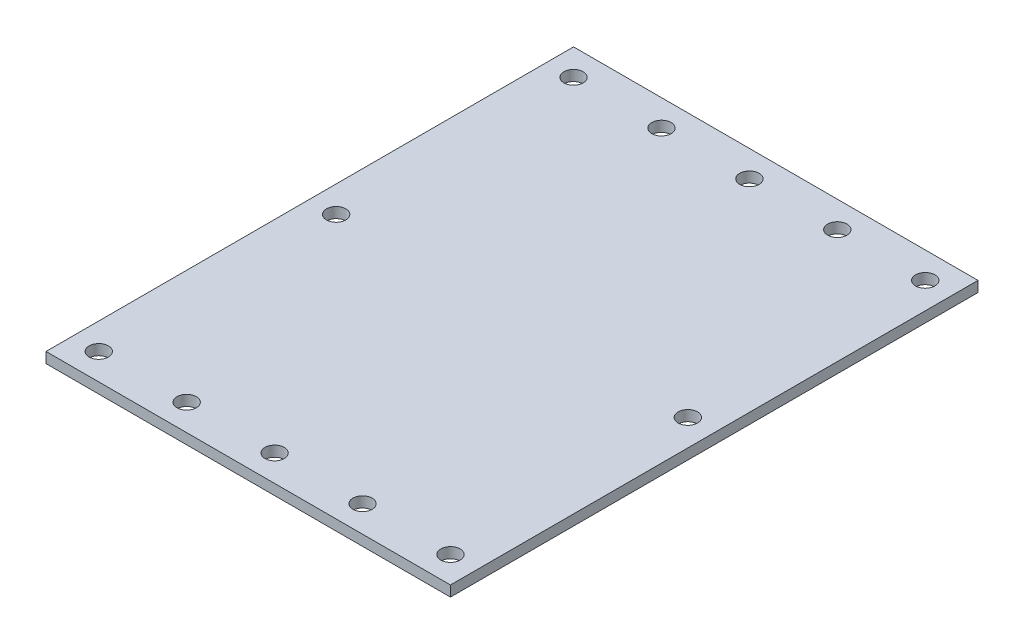
ISO-10303-21;
HEADER;
FILE_DESCRIPTION(('STEP AP214'),'2;1');
FILE_NAME('part.step','',(''),(''),'','','');
FILE_SCHEMA(('AUTOMOTIVE_DESIGN { 1 0 10303 214 1 1 1 1 }'));
ENDSEC;
DATA;
#1=APPLICATION_CONTEXT('core data for automotive mechanical design processes');
#2=APPLICATION_PROTOCOL_DEFINITION('international standard','automotive_design',2000,#1);
#3=PRODUCT_CONTEXT('',#1,'mechanical');
#4=PRODUCT('Part','Part','',(#3));
#5=PRODUCT_RELATED_PRODUCT_CATEGORY('part','',(#4));
#6=PRODUCT_DEFINITION_FORMATION('','',#4);
#7=PRODUCT_DEFINITION_CONTEXT('part definition',#1,'design');
#8=PRODUCT_DEFINITION('design','',#6,#7);
#9=PRODUCT_DEFINITION_SHAPE('','',#8);
#10=(LENGTH_UNIT() NAMED_UNIT(*) SI_UNIT(.MILLI.,.METRE.));
#11=(NAMED_UNIT(*) PLANE_ANGLE_UNIT() SI_UNIT($,.RADIAN.));
#12=(NAMED_UNIT(*) SI_UNIT($,.STERADIAN.) SOLID_ANGLE_UNIT());
#13=UNCERTAINTY_MEASURE_WITH_UNIT(LENGTH_MEASURE(1.E-05),#10,'distance_accuracy_value','');
#14=(GEOMETRIC_REPRESENTATION_CONTEXT(3) GLOBAL_UNCERTAINTY_ASSIGNED_CONTEXT((#13)) GLOBAL_UNIT_ASSIGNED_CONTEXT((#10,
#11,#12)) REPRESENTATION_CONTEXT('',''));
#15=CARTESIAN_POINT('',(0.,0.,0.));
#16=DIRECTION('',(0.,0.,1.));
#17=DIRECTION('',(1.,0.,0.));
#18=AXIS2_PLACEMENT_3D('',#15,#16,#17);
#19=CARTESIAN_POINT('',(0.,6.,0.));
#20=DIRECTION('',(0.,-1.,0.));
#21=DIRECTION('',(0.,0.,-1.));
#22=AXIS2_PLACEMENT_3D('',#19,#20,#21);
#23=PLANE('',#22);
#24=DIRECTION('',(0.,0.,1.));
#25=VECTOR('',#24,1.);
#26=CARTESIAN_POINT('',(0.,6.,0.));
#27=LINE('',#26,#25);
#28=CARTESIAN_POINT('',(0.,6.,-300.));
#29=VERTEX_POINT('',#28);
#30=CARTESIAN_POINT('',(0.,6.,0.));
#31=VERTEX_POINT('',#30);
#32=EDGE_CURVE('E90',#29,#31,#27,.T.);
#33=ORIENTED_EDGE('',*,*,#32,.T.);
#34=DIRECTION('',(1.,0.,0.));
#35=VECTOR('',#34,1.);
#36=CARTESIAN_POINT('',(0.,6.,0.));
#37=LINE('',#36,#35);
#38=CARTESIAN_POINT('',(230.,6.,0.));
#39=VERTEX_POINT('',#38);
#40=EDGE_CURVE('E85',#31,#39,#37,.T.);
#41=ORIENTED_EDGE('',*,*,#40,.T.);
#42=DIRECTION('',(0.,0.,-1.));
#43=VECTOR('',#42,1.);
#44=CARTESIAN_POINT('',(230.,6.,0.));
#45=LINE('',#44,#43);
#46=CARTESIAN_POINT('',(230.,6.,-300.));
#47=VERTEX_POINT('',#46);
#48=EDGE_CURVE('E88',#39,#47,#45,.T.);
#49=ORIENTED_EDGE('',*,*,#48,.T.);
#50=DIRECTION('',(-1.,0.,0.));
#51=VECTOR('',#50,1.);
#52=CARTESIAN_POINT('',(0.,6.,-300.));
#53=LINE('',#52,#51);
#54=EDGE_CURVE('E55',#47,#29,#53,.T.);
#55=ORIENTED_EDGE('',*,*,#54,.T.);
#56=EDGE_LOOP('',(#33,#41,#49,#55));
#57=FACE_BOUND('',#56,.T.);
#58=CARTESIAN_POINT('',(15.,6.,-15.));
#59=DIRECTION('',(0.,1.,0.));
#60=DIRECTION('',(0.,0.,1.));
#61=AXIS2_PLACEMENT_3D('',#58,#59,#60);
#62=CIRCLE('',#61,5.5);
#63=CARTESIAN_POINT('',(15.,6.,-9.5));
#64=VERTEX_POINT('',#63);
#65=EDGE_CURVE('E105',#64,#64,#62,.T.);
#66=ORIENTED_EDGE('',*,*,#65,.F.);
#67=EDGE_LOOP('',(#66));
#68=FACE_BOUND('',#67,.T.);
#69=CARTESIAN_POINT('',(15.,6.,-285.));
#70=DIRECTION('',(0.,1.,0.));
#71=DIRECTION('',(0.,0.,1.));
#72=AXIS2_PLACEMENT_3D('',#69,#70,#71);
#73=CIRCLE('',#72,5.5);
#74=CARTESIAN_POINT('',(15.,6.,-279.5));
#75=VERTEX_POINT('',#74);
#76=EDGE_CURVE('E120',#75,#75,#73,.T.);
#77=ORIENTED_EDGE('',*,*,#76,.F.);
#78=EDGE_LOOP('',(#77));
#79=FACE_BOUND('',#78,.T.);
#80=CARTESIAN_POINT('',(15.,6.,-150.));
#81=DIRECTION('',(0.,1.,0.));
#82=DIRECTION('',(0.,0.,1.));
#83=AXIS2_PLACEMENT_3D('',#80,#81,#82);
#84=CIRCLE('',#83,5.5);
#85=CARTESIAN_POINT('',(15.,6.,-144.5));
#86=VERTEX_POINT('',#85);
#87=EDGE_CURVE('E126',#86,#86,#84,.T.);
#88=ORIENTED_EDGE('',*,*,#87,.F.);
#89=EDGE_LOOP('',(#88));
#90=FACE_BOUND('',#89,.T.);
#91=CARTESIAN_POINT('',(215.,6.,-15.));
#92=DIRECTION('',(0.,1.,0.));
#93=DIRECTION('',(0.,0.,-1.));
#94=AXIS2_PLACEMENT_3D('',#91,#92,#93);
#95=CIRCLE('',#94,5.50000000000002);
#96=CARTESIAN_POINT('',(215.,6.,-20.5));
#97=VERTEX_POINT('',#96);
#98=EDGE_CURVE('E132',#97,#97,#95,.T.);
#99=ORIENTED_EDGE('',*,*,#98,.F.);
#100=EDGE_LOOP('',(#99));
#101=FACE_BOUND('',#100,.T.);
#102=CARTESIAN_POINT('',(215.,6.,-150.));
#103=DIRECTION('',(0.,1.,0.));
#104=DIRECTION('',(0.,0.,-1.));
#105=AXIS2_PLACEMENT_3D('',#102,#103,#104);
#106=CIRCLE('',#105,5.50000000000002);
#107=CARTESIAN_POINT('',(215.,6.,-155.5));
#108=VERTEX_POINT('',#107);
#109=EDGE_CURVE('E138',#108,#108,#106,.T.);
#110=ORIENTED_EDGE('',*,*,#109,.F.);
#111=EDGE_LOOP('',(#110));
#112=FACE_BOUND('',#111,.T.);
#113=CARTESIAN_POINT('',(215.,6.,-285.));
#114=DIRECTION('',(0.,1.,0.));
#115=DIRECTION('',(0.,0.,-1.));
#116=AXIS2_PLACEMENT_3D('',#113,#114,#115);
#117=CIRCLE('',#116,5.50000000000002);
#118=CARTESIAN_POINT('',(215.,6.,-290.5));
#119=VERTEX_POINT('',#118);
#120=EDGE_CURVE('E144',#119,#119,#117,.T.);
#121=ORIENTED_EDGE('',*,*,#120,.F.);
#122=EDGE_LOOP('',(#121));
#123=FACE_BOUND('',#122,.T.);
#124=CARTESIAN_POINT('',(165.,6.,-15.));
#125=DIRECTION('',(0.,1.,0.));
#126=DIRECTION('',(0.,0.,-1.));
#127=AXIS2_PLACEMENT_3D('',#124,#125,#126);
#128=CIRCLE('',#127,5.50000000000002);
#129=CARTESIAN_POINT('',(165.,6.,-20.5));
#130=VERTEX_POINT('',#129);
#131=EDGE_CURVE('E150',#130,#130,#128,.T.);
#132=ORIENTED_EDGE('',*,*,#131,.F.);
#133=EDGE_LOOP('',(#132));
#134=FACE_BOUND('',#133,.T.);
#135=CARTESIAN_POINT('',(115.,6.,-15.));
#136=DIRECTION('',(0.,1.,0.));
#137=DIRECTION('',(0.,0.,-1.));
#138=AXIS2_PLACEMENT_3D('',#135,#136,#137);
#139=CIRCLE('',#138,5.5);
#140=CARTESIAN_POINT('',(115.,6.,-20.5));
#141=VERTEX_POINT('',#140);
#142=EDGE_CURVE('E156',#141,#141,#139,.T.);
#143=ORIENTED_EDGE('',*,*,#142,.F.);
#144=EDGE_LOOP('',(#143));
#145=FACE_BOUND('',#144,.T.);
#146=CARTESIAN_POINT('',(65.,6.,-15.));
#147=DIRECTION('',(0.,1.,0.));
#148=DIRECTION('',(0.,0.,-1.));
#149=AXIS2_PLACEMENT_3D('',#146,#147,#148);
#150=CIRCLE('',#149,5.5);
#151=CARTESIAN_POINT('',(65.,6.,-20.5));
#152=VERTEX_POINT('',#151);
#153=EDGE_CURVE('E162',#152,#152,#150,.T.);
#154=ORIENTED_EDGE('',*,*,#153,.F.);
#155=EDGE_LOOP('',(#154));
#156=FACE_BOUND('',#155,.T.);
#157=CARTESIAN_POINT('',(165.,6.,-285.));
#158=DIRECTION('',(0.,1.,0.));
#159=DIRECTION('',(0.,0.,-1.));
#160=AXIS2_PLACEMENT_3D('',#157,#158,#159);
#161=CIRCLE('',#160,5.50000000000002);
#162=CARTESIAN_POINT('',(165.,6.,-290.5));
#163=VERTEX_POINT('',#162);
#164=EDGE_CURVE('E168',#163,#163,#161,.T.);
#165=ORIENTED_EDGE('',*,*,#164,.F.);
#166=EDGE_LOOP('',(#165));
#167=FACE_BOUND('',#166,.T.);
#168=CARTESIAN_POINT('',(115.,6.,-285.));
#169=DIRECTION('',(0.,1.,0.));
#170=DIRECTION('',(0.,0.,-1.));
#171=AXIS2_PLACEMENT_3D('',#168,#169,#170);
#172=CIRCLE('',#171,5.5);
#173=CARTESIAN_POINT('',(115.,6.,-290.5));
#174=VERTEX_POINT('',#173);
#175=EDGE_CURVE('E174',#174,#174,#172,.T.);
#176=ORIENTED_EDGE('',*,*,#175,.F.);
#177=EDGE_LOOP('',(#176));
#178=FACE_BOUND('',#177,.T.);
#179=CARTESIAN_POINT('',(65.,6.,-285.));
#180=DIRECTION('',(0.,1.,0.));
#181=DIRECTION('',(0.,0.,-1.));
#182=AXIS2_PLACEMENT_3D('',#179,#180,#181);
#183=CIRCLE('',#182,5.5);
#184=CARTESIAN_POINT('',(65.,6.,-290.5));
#185=VERTEX_POINT('',#184);
#186=EDGE_CURVE('E180',#185,#185,#183,.T.);
#187=ORIENTED_EDGE('',*,*,#186,.F.);
#188=EDGE_LOOP('',(#187));
#189=FACE_BOUND('',#188,.T.);
#190=ADVANCED_FACE('F38',(#57,#68,#79,#90,#101,#112,#123,#134,#145,#156,#167,#178,#189),#23,.F.);
#191=CARTESIAN_POINT('',(0.,0.,0.));
#192=DIRECTION('',(0.,-1.,0.));
#193=DIRECTION('',(0.,0.,-1.));
#194=AXIS2_PLACEMENT_3D('',#191,#192,#193);
#195=PLANE('',#194);
#196=CARTESIAN_POINT('',(115.,0.,-285.));
#197=DIRECTION('',(0.,1.,0.));
#198=DIRECTION('',(0.,0.,-1.));
#199=AXIS2_PLACEMENT_3D('',#196,#197,#198);
#200=CIRCLE('',#199,5.5);
#201=CARTESIAN_POINT('',(115.,0.,-290.5));
#202=VERTEX_POINT('',#201);
#203=EDGE_CURVE('E177',#202,#202,#200,.T.);
#204=ORIENTED_EDGE('',*,*,#203,.T.);
#205=EDGE_LOOP('',(#204));
#206=FACE_BOUND('',#205,.T.);
#207=CARTESIAN_POINT('',(65.,0.,-15.));
#208=DIRECTION('',(0.,1.,0.));
#209=DIRECTION('',(0.,0.,-1.));
#210=AXIS2_PLACEMENT_3D('',#207,#208,#209);
#211=CIRCLE('',#210,5.5);
#212=CARTESIAN_POINT('',(65.,0.,-20.5));
#213=VERTEX_POINT('',#212);
#214=EDGE_CURVE('E165',#213,#213,#211,.T.);
#215=ORIENTED_EDGE('',*,*,#214,.T.);
#216=EDGE_LOOP('',(#215));
#217=FACE_BOUND('',#216,.T.);
#218=CARTESIAN_POINT('',(165.,0.,-15.));
#219=DIRECTION('',(0.,1.,0.));
#220=DIRECTION('',(0.,0.,-1.));
#221=AXIS2_PLACEMENT_3D('',#218,#219,#220);
#222=CIRCLE('',#221,5.50000000000002);
#223=CARTESIAN_POINT('',(165.,0.,-20.5));
#224=VERTEX_POINT('',#223);
#225=EDGE_CURVE('E153',#224,#224,#222,.T.);
#226=ORIENTED_EDGE('',*,*,#225,.T.);
#227=EDGE_LOOP('',(#226));
#228=FACE_BOUND('',#227,.T.);
#229=CARTESIAN_POINT('',(215.,0.,-150.));
#230=DIRECTION('',(0.,1.,0.));
#231=DIRECTION('',(0.,0.,-1.));
#232=AXIS2_PLACEMENT_3D('',#229,#230,#231);
#233=CIRCLE('',#232,5.50000000000002);
#234=CARTESIAN_POINT('',(215.,0.,-155.5));
#235=VERTEX_POINT('',#234);
#236=EDGE_CURVE('E141',#235,#235,#233,.T.);
#237=ORIENTED_EDGE('',*,*,#236,.T.);
#238=EDGE_LOOP('',(#237));
#239=FACE_BOUND('',#238,.T.);
#240=CARTESIAN_POINT('',(15.,0.,-150.));
#241=DIRECTION('',(0.,1.,0.));
#242=DIRECTION('',(0.,0.,1.));
#243=AXIS2_PLACEMENT_3D('',#240,#241,#242);
#244=CIRCLE('',#243,5.5);
#245=CARTESIAN_POINT('',(15.,0.,-144.5));
#246=VERTEX_POINT('',#245);
#247=EDGE_CURVE('E129',#246,#246,#244,.T.);
#248=ORIENTED_EDGE('',*,*,#247,.T.);
#249=EDGE_LOOP('',(#248));
#250=FACE_BOUND('',#249,.T.);
#251=CARTESIAN_POINT('',(15.,0.,-15.));
#252=DIRECTION('',(0.,1.,0.));
#253=DIRECTION('',(0.,0.,1.));
#254=AXIS2_PLACEMENT_3D('',#251,#252,#253);
#255=CIRCLE('',#254,5.5);
#256=CARTESIAN_POINT('',(15.,0.,-9.5));
#257=VERTEX_POINT('',#256);
#258=EDGE_CURVE('E117',#257,#257,#255,.T.);
#259=ORIENTED_EDGE('',*,*,#258,.T.);
#260=EDGE_LOOP('',(#259));
#261=FACE_BOUND('',#260,.T.);
#262=DIRECTION('',(0.,0.,1.));
#263=VECTOR('',#262,1.);
#264=CARTESIAN_POINT('',(0.,0.,0.));
#265=LINE('',#264,#263);
#266=CARTESIAN_POINT('',(0.,0.,-300.));
#267=VERTEX_POINT('',#266);
#268=CARTESIAN_POINT('',(0.,0.,0.));
#269=VERTEX_POINT('',#268);
#270=EDGE_CURVE('E102',#267,#269,#265,.T.);
#271=ORIENTED_EDGE('',*,*,#270,.F.);
#272=DIRECTION('',(-1.,0.,0.));
#273=VECTOR('',#272,1.);
#274=CARTESIAN_POINT('',(0.,0.,-300.));
#275=LINE('',#274,#273);
#276=CARTESIAN_POINT('',(230.,0.,-300.));
#277=VERTEX_POINT('',#276);
#278=EDGE_CURVE('E78',#277,#267,#275,.T.);
#279=ORIENTED_EDGE('',*,*,#278,.F.);
#280=DIRECTION('',(0.,0.,-1.));
#281=VECTOR('',#280,1.);
#282=CARTESIAN_POINT('',(230.,0.,0.));
#283=LINE('',#282,#281);
#284=CARTESIAN_POINT('',(230.,0.,0.));
#285=VERTEX_POINT('',#284);
#286=EDGE_CURVE('E72',#285,#277,#283,.T.);
#287=ORIENTED_EDGE('',*,*,#286,.F.);
#288=DIRECTION('',(1.,0.,0.));
#289=VECTOR('',#288,1.);
#290=CARTESIAN_POINT('',(0.,0.,0.));
#291=LINE('',#290,#289);
#292=EDGE_CURVE('E94',#269,#285,#291,.T.);
#293=ORIENTED_EDGE('',*,*,#292,.F.);
#294=EDGE_LOOP('',(#271,#279,#287,#293));
#295=FACE_BOUND('',#294,.T.);
#296=CARTESIAN_POINT('',(15.,0.,-285.));
#297=DIRECTION('',(0.,1.,0.));
#298=DIRECTION('',(0.,0.,1.));
#299=AXIS2_PLACEMENT_3D('',#296,#297,#298);
#300=CIRCLE('',#299,5.5);
#301=CARTESIAN_POINT('',(15.,0.,-279.5));
#302=VERTEX_POINT('',#301);
#303=EDGE_CURVE('E123',#302,#302,#300,.T.);
#304=ORIENTED_EDGE('',*,*,#303,.T.);
#305=EDGE_LOOP('',(#304));
#306=FACE_BOUND('',#305,.T.);
#307=CARTESIAN_POINT('',(215.,0.,-15.));
#308=DIRECTION('',(0.,1.,0.));
#309=DIRECTION('',(0.,0.,-1.));
#310=AXIS2_PLACEMENT_3D('',#307,#308,#309);
#311=CIRCLE('',#310,5.50000000000002);
#312=CARTESIAN_POINT('',(215.,0.,-20.5));
#313=VERTEX_POINT('',#312);
#314=EDGE_CURVE('E135',#313,#313,#311,.T.);
#315=ORIENTED_EDGE('',*,*,#314,.T.);
#316=EDGE_LOOP('',(#315));
#317=FACE_BOUND('',#316,.T.);
#318=CARTESIAN_POINT('',(215.,0.,-285.));
#319=DIRECTION('',(0.,1.,0.));
#320=DIRECTION('',(0.,0.,-1.));
#321=AXIS2_PLACEMENT_3D('',#318,#319,#320);
#322=CIRCLE('',#321,5.50000000000002);
#323=CARTESIAN_POINT('',(215.,0.,-290.5));
#324=VERTEX_POINT('',#323);
#325=EDGE_CURVE('E147',#324,#324,#322,.T.);
#326=ORIENTED_EDGE('',*,*,#325,.T.);
#327=EDGE_LOOP('',(#326));
#328=FACE_BOUND('',#327,.T.);
#329=CARTESIAN_POINT('',(115.,0.,-15.));
#330=DIRECTION('',(0.,1.,0.));
#331=DIRECTION('',(0.,0.,-1.));
#332=AXIS2_PLACEMENT_3D('',#329,#330,#331);
#333=CIRCLE('',#332,5.5);
#334=CARTESIAN_POINT('',(115.,0.,-20.5));
#335=VERTEX_POINT('',#334);
#336=EDGE_CURVE('E159',#335,#335,#333,.T.);
#337=ORIENTED_EDGE('',*,*,#336,.T.);
#338=EDGE_LOOP('',(#337));
#339=FACE_BOUND('',#338,.T.);
#340=CARTESIAN_POINT('',(165.,0.,-285.));
#341=DIRECTION('',(0.,1.,0.));
#342=DIRECTION('',(0.,0.,-1.));
#343=AXIS2_PLACEMENT_3D('',#340,#341,#342);
#344=CIRCLE('',#343,5.50000000000002);
#345=CARTESIAN_POINT('',(165.,0.,-290.5));
#346=VERTEX_POINT('',#345);
#347=EDGE_CURVE('E171',#346,#346,#344,.T.);
#348=ORIENTED_EDGE('',*,*,#347,.T.);
#349=EDGE_LOOP('',(#348));
#350=FACE_BOUND('',#349,.T.);
#351=CARTESIAN_POINT('',(65.,0.,-285.));
#352=DIRECTION('',(0.,1.,0.));
#353=DIRECTION('',(0.,0.,-1.));
#354=AXIS2_PLACEMENT_3D('',#351,#352,#353);
#355=CIRCLE('',#354,5.5);
#356=CARTESIAN_POINT('',(65.,0.,-290.5));
#357=VERTEX_POINT('',#356);
#358=EDGE_CURVE('E183',#357,#357,#355,.T.);
#359=ORIENTED_EDGE('',*,*,#358,.T.);
#360=EDGE_LOOP('',(#359));
#361=FACE_BOUND('',#360,.T.);
#362=ADVANCED_FACE('F113',(#206,#217,#228,#239,#250,#261,#295,#306,#317,#328,#339,#350,#361),
#195,.T.);
#363=CARTESIAN_POINT('',(0.,6.,0.));
#364=DIRECTION('',(1.,0.,0.));
#365=DIRECTION('',(0.,0.,-1.));
#366=AXIS2_PLACEMENT_3D('',#363,#364,#365);
#367=PLANE('',#366);
#368=ORIENTED_EDGE('',*,*,#270,.T.);
#369=DIRECTION('',(0.,-1.,0.));
#370=VECTOR('',#369,1.);
#371=CARTESIAN_POINT('',(0.,6.,0.));
#372=LINE('',#371,#370);
#373=EDGE_CURVE('E11',#31,#269,#372,.T.);
#374=ORIENTED_EDGE('',*,*,#373,.F.);
#375=ORIENTED_EDGE('',*,*,#32,.F.);
#376=DIRECTION('',(0.,-1.,0.));
#377=VECTOR('',#376,1.);
#378=CARTESIAN_POINT('',(0.,6.,-300.));
#379=LINE('',#378,#377);
#380=EDGE_CURVE('E98',#29,#267,#379,.T.);
#381=ORIENTED_EDGE('',*,*,#380,.T.);
#382=EDGE_LOOP('',(#368,#374,#375,#381));
#383=FACE_BOUND('',#382,.T.);
#384=ADVANCED_FACE('F40',(#383),#367,.F.);
#385=CARTESIAN_POINT('',(0.,6.,0.));
#386=DIRECTION('',(0.,0.,-1.));
#387=DIRECTION('',(-1.,0.,0.));
#388=AXIS2_PLACEMENT_3D('',#385,#386,#387);
#389=PLANE('',#388);
#390=ORIENTED_EDGE('',*,*,#292,.T.);
#391=DIRECTION('',(0.,-1.,0.));
#392=VECTOR('',#391,1.);
#393=CARTESIAN_POINT('',(230.,6.,0.));
#394=LINE('',#393,#392);
#395=EDGE_CURVE('E47',#39,#285,#394,.T.);
#396=ORIENTED_EDGE('',*,*,#395,.F.);
#397=ORIENTED_EDGE('',*,*,#40,.F.);
#398=ORIENTED_EDGE('',*,*,#373,.T.);
#399=EDGE_LOOP('',(#390,#396,#397,#398));
#400=FACE_BOUND('',#399,.T.);
#401=ADVANCED_FACE('F93',(#400),#389,.F.);
#402=CARTESIAN_POINT('',(230.,6.,0.));
#403=DIRECTION('',(-1.,0.,0.));
#404=DIRECTION('',(0.,0.,1.));
#405=AXIS2_PLACEMENT_3D('',#402,#403,#404);
#406=PLANE('',#405);
#407=ORIENTED_EDGE('',*,*,#286,.T.);
#408=DIRECTION('',(0.,-1.,0.));
#409=VECTOR('',#408,1.);
#410=CARTESIAN_POINT('',(230.,6.,-300.));
#411=LINE('',#410,#409);
#412=EDGE_CURVE('E95',#47,#277,#411,.T.);
#413=ORIENTED_EDGE('',*,*,#412,.F.);
#414=ORIENTED_EDGE('',*,*,#48,.F.);
#415=ORIENTED_EDGE('',*,*,#395,.T.);
#416=EDGE_LOOP('',(#407,#413,#414,#415));
#417=FACE_BOUND('',#416,.T.);
#418=ADVANCED_FACE('F96',(#417),#406,.F.);
#419=CARTESIAN_POINT('',(0.,6.,-300.));
#420=DIRECTION('',(0.,0.,1.));
#421=DIRECTION('',(1.,0.,0.));
#422=AXIS2_PLACEMENT_3D('',#419,#420,#421);
#423=PLANE('',#422);
#424=ORIENTED_EDGE('',*,*,#278,.T.);
#425=ORIENTED_EDGE('',*,*,#380,.F.);
#426=ORIENTED_EDGE('',*,*,#54,.F.);
#427=ORIENTED_EDGE('',*,*,#412,.T.);
#428=EDGE_LOOP('',(#424,#425,#426,#427));
#429=FACE_BOUND('',#428,.T.);
#430=ADVANCED_FACE('F110',(#429),#423,.F.);
#431=CARTESIAN_POINT('',(15.,6.,-15.));
#432=DIRECTION('',(0.,-1.,0.));
#433=DIRECTION('',(0.,0.,-1.));
#434=AXIS2_PLACEMENT_3D('',#431,#432,#433);
#435=CYLINDRICAL_SURFACE('',#434,5.5);
#436=ORIENTED_EDGE('',*,*,#65,.T.);
#437=EDGE_LOOP('',(#436));
#438=FACE_BOUND('',#437,.T.);
#439=ORIENTED_EDGE('',*,*,#258,.F.);
#440=EDGE_LOOP('',(#439));
#441=FACE_BOUND('',#440,.T.);
#442=ADVANCED_FACE('F200',(#438,#441),#435,.F.);
#443=CARTESIAN_POINT('',(15.,6.,-285.));
#444=DIRECTION('',(0.,-1.,0.));
#445=DIRECTION('',(0.,0.,-1.));
#446=AXIS2_PLACEMENT_3D('',#443,#444,#445);
#447=CYLINDRICAL_SURFACE('',#446,5.5);
#448=ORIENTED_EDGE('',*,*,#76,.T.);
#449=EDGE_LOOP('',(#448));
#450=FACE_BOUND('',#449,.T.);
#451=ORIENTED_EDGE('',*,*,#303,.F.);
#452=EDGE_LOOP('',(#451));
#453=FACE_BOUND('',#452,.T.);
#454=ADVANCED_FACE('F246',(#450,#453),#447,.F.);
#455=CARTESIAN_POINT('',(15.,6.,-150.));
#456=DIRECTION('',(0.,-1.,0.));
#457=DIRECTION('',(0.,0.,-1.));
#458=AXIS2_PLACEMENT_3D('',#455,#456,#457);
#459=CYLINDRICAL_SURFACE('',#458,5.5);
#460=ORIENTED_EDGE('',*,*,#87,.T.);
#461=EDGE_LOOP('',(#460));
#462=FACE_BOUND('',#461,.T.);
#463=ORIENTED_EDGE('',*,*,#247,.F.);
#464=EDGE_LOOP('',(#463));
#465=FACE_BOUND('',#464,.T.);
#466=ADVANCED_FACE('F254',(#462,#465),#459,.F.);
#467=CARTESIAN_POINT('',(215.,6.,-15.));
#468=DIRECTION('',(0.,-1.,0.));
#469=DIRECTION('',(0.,0.,-1.));
#470=AXIS2_PLACEMENT_3D('',#467,#468,#469);
#471=CYLINDRICAL_SURFACE('',#470,5.50000000000002);
#472=ORIENTED_EDGE('',*,*,#98,.T.);
#473=EDGE_LOOP('',(#472));
#474=FACE_BOUND('',#473,.T.);
#475=ORIENTED_EDGE('',*,*,#314,.F.);
#476=EDGE_LOOP('',(#475));
#477=FACE_BOUND('',#476,.T.);
#478=ADVANCED_FACE('F262',(#474,#477),#471,.F.);
#479=CARTESIAN_POINT('',(215.,6.,-150.));
#480=DIRECTION('',(0.,-1.,0.));
#481=DIRECTION('',(0.,0.,-1.));
#482=AXIS2_PLACEMENT_3D('',#479,#480,#481);
#483=CYLINDRICAL_SURFACE('',#482,5.50000000000002);
#484=ORIENTED_EDGE('',*,*,#109,.T.);
#485=EDGE_LOOP('',(#484));
#486=FACE_BOUND('',#485,.T.);
#487=ORIENTED_EDGE('',*,*,#236,.F.);
#488=EDGE_LOOP('',(#487));
#489=FACE_BOUND('',#488,.T.);
#490=ADVANCED_FACE('F271',(#486,#489),#483,.F.);
#491=CARTESIAN_POINT('',(215.,6.,-285.));
#492=DIRECTION('',(0.,-1.,0.));
#493=DIRECTION('',(0.,0.,-1.));
#494=AXIS2_PLACEMENT_3D('',#491,#492,#493);
#495=CYLINDRICAL_SURFACE('',#494,5.50000000000002);
#496=ORIENTED_EDGE('',*,*,#120,.T.);
#497=EDGE_LOOP('',(#496));
#498=FACE_BOUND('',#497,.T.);
#499=ORIENTED_EDGE('',*,*,#325,.F.);
#500=EDGE_LOOP('',(#499));
#501=FACE_BOUND('',#500,.T.);
#502=ADVANCED_FACE('F280',(#498,#501),#495,.F.);
#503=CARTESIAN_POINT('',(165.,6.,-15.));
#504=DIRECTION('',(0.,-1.,0.));
#505=DIRECTION('',(0.,0.,-1.));
#506=AXIS2_PLACEMENT_3D('',#503,#504,#505);
#507=CYLINDRICAL_SURFACE('',#506,5.50000000000002);
#508=ORIENTED_EDGE('',*,*,#131,.T.);
#509=EDGE_LOOP('',(#508));
#510=FACE_BOUND('',#509,.T.);
#511=ORIENTED_EDGE('',*,*,#225,.F.);
#512=EDGE_LOOP('',(#511));
#513=FACE_BOUND('',#512,.T.);
#514=ADVANCED_FACE('F289',(#510,#513),#507,.F.);
#515=CARTESIAN_POINT('',(115.,6.,-15.));
#516=DIRECTION('',(0.,-1.,0.));
#517=DIRECTION('',(0.,0.,-1.));
#518=AXIS2_PLACEMENT_3D('',#515,#516,#517);
#519=CYLINDRICAL_SURFACE('',#518,5.5);
#520=ORIENTED_EDGE('',*,*,#142,.T.);
#521=EDGE_LOOP('',(#520));
#522=FACE_BOUND('',#521,.T.);
#523=ORIENTED_EDGE('',*,*,#336,.F.);
#524=EDGE_LOOP('',(#523));
#525=FACE_BOUND('',#524,.T.);
#526=ADVANCED_FACE('F298',(#522,#525),#519,.F.);
#527=CARTESIAN_POINT('',(65.,6.,-15.));
#528=DIRECTION('',(0.,-1.,0.));
#529=DIRECTION('',(0.,0.,-1.));
#530=AXIS2_PLACEMENT_3D('',#527,#528,#529);
#531=CYLINDRICAL_SURFACE('',#530,5.5);
#532=ORIENTED_EDGE('',*,*,#153,.T.);
#533=EDGE_LOOP('',(#532));
#534=FACE_BOUND('',#533,.T.);
#535=ORIENTED_EDGE('',*,*,#214,.F.);
#536=EDGE_LOOP('',(#535));
#537=FACE_BOUND('',#536,.T.);
#538=ADVANCED_FACE('F307',(#534,#537),#531,.F.);
#539=CARTESIAN_POINT('',(165.,6.,-285.));
#540=DIRECTION('',(0.,-1.,0.));
#541=DIRECTION('',(0.,0.,-1.));
#542=AXIS2_PLACEMENT_3D('',#539,#540,#541);
#543=CYLINDRICAL_SURFACE('',#542,5.50000000000002);
#544=ORIENTED_EDGE('',*,*,#164,.T.);
#545=EDGE_LOOP('',(#544));
#546=FACE_BOUND('',#545,.T.);
#547=ORIENTED_EDGE('',*,*,#347,.F.);
#548=EDGE_LOOP('',(#547));
#549=FACE_BOUND('',#548,.T.);
#550=ADVANCED_FACE('F316',(#546,#549),#543,.F.);
#551=CARTESIAN_POINT('',(115.,6.,-285.));
#552=DIRECTION('',(0.,-1.,0.));
#553=DIRECTION('',(0.,0.,-1.));
#554=AXIS2_PLACEMENT_3D('',#551,#552,#553);
#555=CYLINDRICAL_SURFACE('',#554,5.5);
#556=ORIENTED_EDGE('',*,*,#175,.T.);
#557=EDGE_LOOP('',(#556));
#558=FACE_BOUND('',#557,.T.);
#559=ORIENTED_EDGE('',*,*,#203,.F.);
#560=EDGE_LOOP('',(#559));
#561=FACE_BOUND('',#560,.T.);
#562=ADVANCED_FACE('F325',(#558,#561),#555,.F.);
#563=CARTESIAN_POINT('',(65.,6.,-285.));
#564=DIRECTION('',(0.,-1.,0.));
#565=DIRECTION('',(0.,0.,-1.));
#566=AXIS2_PLACEMENT_3D('',#563,#564,#565);
#567=CYLINDRICAL_SURFACE('',#566,5.5);
#568=ORIENTED_EDGE('',*,*,#186,.T.);
#569=EDGE_LOOP('',(#568));
#570=FACE_BOUND('',#569,.T.);
#571=ORIENTED_EDGE('',*,*,#358,.F.);
#572=EDGE_LOOP('',(#571));
#573=FACE_BOUND('',#572,.T.);
#574=ADVANCED_FACE('F189',(#570,#573),#567,.F.);
#575=CLOSED_SHELL('',(#190,#362,#384,#401,#418,#430,#442,#454,#466,#478,#490,#502,#514,#526,
#538,#550,#562,#574));
#576=MANIFOLD_SOLID_BREP('B2',#575);
#577=ADVANCED_BREP_SHAPE_REPRESENTATION('',(#18,#576),#14);
#578=SHAPE_DEFINITION_REPRESENTATION(#9,#577);
ENDSEC;
END-ISO-10303-21;
